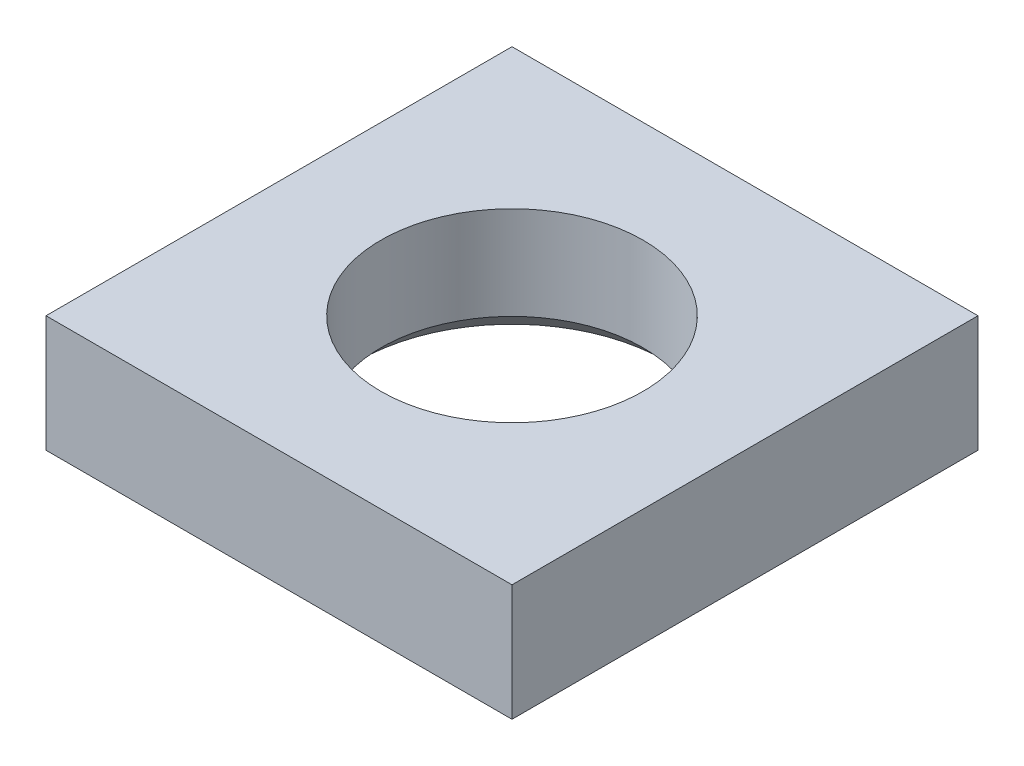
ISO-10303-21;
HEADER;
FILE_DESCRIPTION(('STEP AP214'),'2;1');
FILE_NAME('part.step','',(''),(''),'','','');
FILE_SCHEMA(('AUTOMOTIVE_DESIGN { 1 0 10303 214 1 1 1 1 }'));
ENDSEC;
DATA;
#1=APPLICATION_CONTEXT('core data for automotive mechanical design processes');
#2=APPLICATION_PROTOCOL_DEFINITION('international standard','automotive_design',2000,#1);
#3=PRODUCT_CONTEXT('',#1,'mechanical');
#4=PRODUCT('Part','Part','',(#3));
#5=PRODUCT_RELATED_PRODUCT_CATEGORY('part','',(#4));
#6=PRODUCT_DEFINITION_FORMATION('','',#4);
#7=PRODUCT_DEFINITION_CONTEXT('part definition',#1,'design');
#8=PRODUCT_DEFINITION('design','',#6,#7);
#9=PRODUCT_DEFINITION_SHAPE('','',#8);
#10=(LENGTH_UNIT() NAMED_UNIT(*) SI_UNIT(.MILLI.,.METRE.));
#11=(NAMED_UNIT(*) PLANE_ANGLE_UNIT() SI_UNIT($,.RADIAN.));
#12=(NAMED_UNIT(*) SI_UNIT($,.STERADIAN.) SOLID_ANGLE_UNIT());
#13=UNCERTAINTY_MEASURE_WITH_UNIT(LENGTH_MEASURE(1.E-05),#10,'distance_accuracy_value','');
#14=(GEOMETRIC_REPRESENTATION_CONTEXT(3) GLOBAL_UNCERTAINTY_ASSIGNED_CONTEXT((#13)) GLOBAL_UNIT_ASSIGNED_CONTEXT((#10,
#11,#12)) REPRESENTATION_CONTEXT('',''));
#15=CARTESIAN_POINT('',(0.,0.,0.));
#16=DIRECTION('',(0.,0.,1.));
#17=DIRECTION('',(1.,0.,0.));
#18=AXIS2_PLACEMENT_3D('',#15,#16,#17);
#19=CARTESIAN_POINT('',(25.4,12.7,25.4));
#20=DIRECTION('',(-1.,0.,0.));
#21=DIRECTION('',(0.,0.,1.));
#22=AXIS2_PLACEMENT_3D('',#19,#20,#21);
#23=PLANE('',#22);
#24=DIRECTION('',(0.,0.,-1.));
#25=VECTOR('',#24,1.);
#26=CARTESIAN_POINT('',(25.4,0.,25.4));
#27=LINE('',#26,#25);
#28=CARTESIAN_POINT('',(25.4,0.,25.4));
#29=VERTEX_POINT('',#28);
#30=CARTESIAN_POINT('',(25.4,0.,-25.4));
#31=VERTEX_POINT('',#30);
#32=EDGE_CURVE('E99',#29,#31,#27,.T.);
#33=ORIENTED_EDGE('',*,*,#32,.T.);
#34=DIRECTION('',(0.,-1.,0.));
#35=VECTOR('',#34,1.);
#36=CARTESIAN_POINT('',(25.4,12.7,-25.4));
#37=LINE('',#36,#35);
#38=CARTESIAN_POINT('',(25.4,12.7,-25.4));
#39=VERTEX_POINT('',#38);
#40=EDGE_CURVE('E90',#39,#31,#37,.T.);
#41=ORIENTED_EDGE('',*,*,#40,.F.);
#42=DIRECTION('',(0.,0.,-1.));
#43=VECTOR('',#42,1.);
#44=CARTESIAN_POINT('',(25.4,12.7,25.4));
#45=LINE('',#44,#43);
#46=CARTESIAN_POINT('',(25.4,12.7,25.4));
#47=VERTEX_POINT('',#46);
#48=EDGE_CURVE('E84',#47,#39,#45,.T.);
#49=ORIENTED_EDGE('',*,*,#48,.F.);
#50=DIRECTION('',(0.,-1.,0.));
#51=VECTOR('',#50,1.);
#52=CARTESIAN_POINT('',(25.4,12.7,25.4));
#53=LINE('',#52,#51);
#54=EDGE_CURVE('E95',#47,#29,#53,.T.);
#55=ORIENTED_EDGE('',*,*,#54,.T.);
#56=EDGE_LOOP('',(#33,#41,#49,#55));
#57=FACE_BOUND('',#56,.T.);
#58=ADVANCED_FACE('F31',(#57),#23,.F.);
#59=CARTESIAN_POINT('',(-25.4,12.7,-25.4));
#60=DIRECTION('',(0.,0.,1.));
#61=DIRECTION('',(1.,0.,0.));
#62=AXIS2_PLACEMENT_3D('',#59,#60,#61);
#63=PLANE('',#62);
#64=DIRECTION('',(-1.,0.,0.));
#65=VECTOR('',#64,1.);
#66=CARTESIAN_POINT('',(-25.4,0.,-25.4));
#67=LINE('',#66,#65);
#68=CARTESIAN_POINT('',(-25.4,0.,-25.4));
#69=VERTEX_POINT('',#68);
#70=EDGE_CURVE('E89',#31,#69,#67,.T.);
#71=ORIENTED_EDGE('',*,*,#70,.T.);
#72=DIRECTION('',(0.,-1.,0.));
#73=VECTOR('',#72,1.);
#74=CARTESIAN_POINT('',(-25.4,12.7,-25.4));
#75=LINE('',#74,#73);
#76=CARTESIAN_POINT('',(-25.4,12.7,-25.4));
#77=VERTEX_POINT('',#76);
#78=EDGE_CURVE('E87',#77,#69,#75,.T.);
#79=ORIENTED_EDGE('',*,*,#78,.F.);
#80=DIRECTION('',(-1.,0.,0.));
#81=VECTOR('',#80,1.);
#82=CARTESIAN_POINT('',(-25.4,12.7,-25.4));
#83=LINE('',#82,#81);
#84=EDGE_CURVE('E79',#39,#77,#83,.T.);
#85=ORIENTED_EDGE('',*,*,#84,.F.);
#86=ORIENTED_EDGE('',*,*,#40,.T.);
#87=EDGE_LOOP('',(#71,#79,#85,#86));
#88=FACE_BOUND('',#87,.T.);
#89=ADVANCED_FACE('F88',(#88),#63,.F.);
#90=CARTESIAN_POINT('',(-25.4,12.7,25.4));
#91=DIRECTION('',(1.,0.,0.));
#92=DIRECTION('',(0.,0.,-1.));
#93=AXIS2_PLACEMENT_3D('',#90,#91,#92);
#94=PLANE('',#93);
#95=DIRECTION('',(0.,0.,1.));
#96=VECTOR('',#95,1.);
#97=CARTESIAN_POINT('',(-25.4,0.,25.4));
#98=LINE('',#97,#96);
#99=CARTESIAN_POINT('',(-25.4,0.,25.4));
#100=VERTEX_POINT('',#99);
#101=EDGE_CURVE('E65',#69,#100,#98,.T.);
#102=ORIENTED_EDGE('',*,*,#101,.T.);
#103=DIRECTION('',(0.,-1.,0.));
#104=VECTOR('',#103,1.);
#105=CARTESIAN_POINT('',(-25.4,12.7,25.4));
#106=LINE('',#105,#104);
#107=CARTESIAN_POINT('',(-25.4,12.7,25.4));
#108=VERTEX_POINT('',#107);
#109=EDGE_CURVE('E91',#108,#100,#106,.T.);
#110=ORIENTED_EDGE('',*,*,#109,.F.);
#111=DIRECTION('',(0.,0.,1.));
#112=VECTOR('',#111,1.);
#113=CARTESIAN_POINT('',(-25.4,12.7,25.4));
#114=LINE('',#113,#112);
#115=EDGE_CURVE('E82',#77,#108,#114,.T.);
#116=ORIENTED_EDGE('',*,*,#115,.F.);
#117=ORIENTED_EDGE('',*,*,#78,.T.);
#118=EDGE_LOOP('',(#102,#110,#116,#117));
#119=FACE_BOUND('',#118,.T.);
#120=ADVANCED_FACE('F93',(#119),#94,.F.);
#121=CARTESIAN_POINT('',(-25.4,12.7,25.4));
#122=DIRECTION('',(0.,0.,-1.));
#123=DIRECTION('',(-1.,0.,0.));
#124=AXIS2_PLACEMENT_3D('',#121,#122,#123);
#125=PLANE('',#124);
#126=DIRECTION('',(1.,0.,0.));
#127=VECTOR('',#126,1.);
#128=CARTESIAN_POINT('',(-25.4,0.,25.4));
#129=LINE('',#128,#127);
#130=EDGE_CURVE('E71',#100,#29,#129,.T.);
#131=ORIENTED_EDGE('',*,*,#130,.T.);
#132=ORIENTED_EDGE('',*,*,#54,.F.);
#133=DIRECTION('',(1.,0.,0.));
#134=VECTOR('',#133,1.);
#135=CARTESIAN_POINT('',(-25.4,12.7,25.4));
#136=LINE('',#135,#134);
#137=EDGE_CURVE('E48',#108,#47,#136,.T.);
#138=ORIENTED_EDGE('',*,*,#137,.F.);
#139=ORIENTED_EDGE('',*,*,#109,.T.);
#140=EDGE_LOOP('',(#131,#132,#138,#139));
#141=FACE_BOUND('',#140,.T.);
#142=ADVANCED_FACE('F132',(#141),#125,.F.);
#143=CARTESIAN_POINT('',(25.4,12.7,-25.4));
#144=DIRECTION('',(0.,-1.,0.));
#145=DIRECTION('',(0.,0.,-1.));
#146=AXIS2_PLACEMENT_3D('',#143,#144,#145);
#147=PLANE('',#146);
#148=CARTESIAN_POINT('',(0.,12.7,0.));
#149=DIRECTION('',(0.,1.,0.));
#150=DIRECTION('',(0.,0.,1.));
#151=AXIS2_PLACEMENT_3D('',#148,#149,#150);
#152=CIRCLE('',#151,14.2875);
#153=CARTESIAN_POINT('',(0.,12.7,14.2875));
#154=VERTEX_POINT('',#153);
#155=EDGE_CURVE('E102',#154,#154,#152,.T.);
#156=ORIENTED_EDGE('',*,*,#155,.F.);
#157=EDGE_LOOP('',(#156));
#158=FACE_BOUND('',#157,.T.);
#159=ORIENTED_EDGE('',*,*,#48,.T.);
#160=ORIENTED_EDGE('',*,*,#84,.T.);
#161=ORIENTED_EDGE('',*,*,#115,.T.);
#162=ORIENTED_EDGE('',*,*,#137,.T.);
#163=EDGE_LOOP('',(#159,#160,#161,#162));
#164=FACE_BOUND('',#163,.T.);
#165=ADVANCED_FACE('F80',(#158,#164),#147,.F.);
#166=CARTESIAN_POINT('',(25.4,0.,-25.4));
#167=DIRECTION('',(0.,-1.,0.));
#168=DIRECTION('',(0.,0.,-1.));
#169=AXIS2_PLACEMENT_3D('',#166,#167,#168);
#170=PLANE('',#169);
#171=CARTESIAN_POINT('',(0.,0.,0.));
#172=DIRECTION('',(0.,-1.,0.));
#173=DIRECTION('',(0.,0.,-1.));
#174=AXIS2_PLACEMENT_3D('',#171,#172,#173);
#175=CIRCLE('',#174,16.8275);
#176=CARTESIAN_POINT('',(0.,0.,-16.8275));
#177=VERTEX_POINT('',#176);
#178=EDGE_CURVE('E40',#177,#177,#175,.F.);
#179=ORIENTED_EDGE('',*,*,#178,.T.);
#180=EDGE_LOOP('',(#179));
#181=FACE_BOUND('',#180,.T.);
#182=ORIENTED_EDGE('',*,*,#32,.F.);
#183=ORIENTED_EDGE('',*,*,#130,.F.);
#184=ORIENTED_EDGE('',*,*,#101,.F.);
#185=ORIENTED_EDGE('',*,*,#70,.F.);
#186=EDGE_LOOP('',(#182,#183,#184,#185));
#187=FACE_BOUND('',#186,.T.);
#188=ADVANCED_FACE('F111',(#181,#187),#170,.T.);
#189=CARTESIAN_POINT('',(0.,-0.000999999999999265,0.));
#190=DIRECTION('',(0.,1.,0.));
#191=DIRECTION('',(0.,0.,1.));
#192=AXIS2_PLACEMENT_3D('',#189,#190,#191);
#193=CYLINDRICAL_SURFACE('',#192,14.2875);
#194=CARTESIAN_POINT('',(0.,2.54000000000001,0.));
#195=DIRECTION('',(0.,-1.,0.));
#196=DIRECTION('',(0.,0.,-1.));
#197=AXIS2_PLACEMENT_3D('',#194,#195,#196);
#198=CIRCLE('',#197,14.2875);
#199=CARTESIAN_POINT('',(0.,2.54000000000001,-14.2875));
#200=VERTEX_POINT('',#199);
#201=EDGE_CURVE('E11',#200,#200,#198,.T.);
#202=ORIENTED_EDGE('',*,*,#201,.T.);
#203=EDGE_LOOP('',(#202));
#204=FACE_BOUND('',#203,.T.);
#205=ORIENTED_EDGE('',*,*,#155,.T.);
#206=EDGE_LOOP('',(#205));
#207=FACE_BOUND('',#206,.T.);
#208=ADVANCED_FACE('F115',(#204,#207),#193,.F.);
#209=CARTESIAN_POINT('',(0.,0.,0.));
#210=DIRECTION('',(0.,-1.,0.));
#211=DIRECTION('',(0.,0.,-1.));
#212=AXIS2_PLACEMENT_3D('',#209,#210,#211);
#213=CONICAL_SURFACE('',#212,16.8275,0.785398163397447);
#214=ORIENTED_EDGE('',*,*,#201,.F.);
#215=EDGE_LOOP('',(#214));
#216=FACE_BOUND('',#215,.T.);
#217=ORIENTED_EDGE('',*,*,#178,.F.);
#218=EDGE_LOOP('',(#217));
#219=FACE_BOUND('',#218,.T.);
#220=ADVANCED_FACE('F33',(#216,#219),#213,.F.);
#221=CLOSED_SHELL('',(#58,#89,#120,#142,#165,#188,#208,#220));
#222=MANIFOLD_SOLID_BREP('B2',#221);
#223=ADVANCED_BREP_SHAPE_REPRESENTATION('',(#18,#222),#14);
#224=SHAPE_DEFINITION_REPRESENTATION(#9,#223);
ENDSEC;
END-ISO-10303-21;
